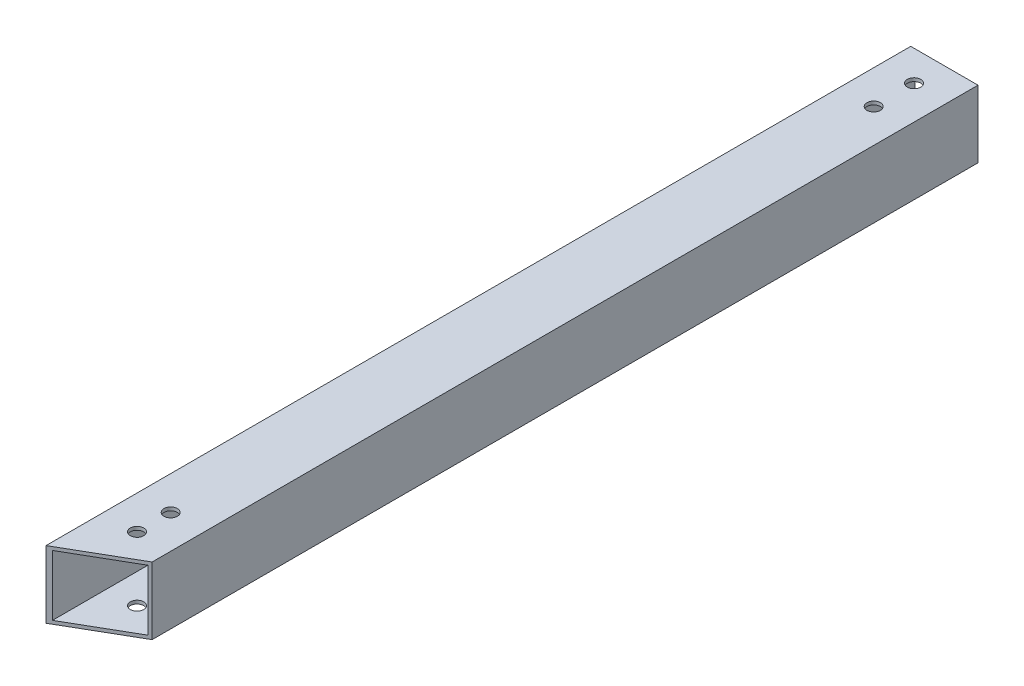
ISO-10303-21;
HEADER;
FILE_DESCRIPTION(('STEP AP214'),'2;1');
FILE_NAME('part.step','',(''),(''),'','','');
FILE_SCHEMA(('AUTOMOTIVE_DESIGN { 1 0 10303 214 1 1 1 1 }'));
ENDSEC;
DATA;
#1=APPLICATION_CONTEXT('core data for automotive mechanical design processes');
#2=APPLICATION_PROTOCOL_DEFINITION('international standard','automotive_design',2000,#1);
#3=PRODUCT_CONTEXT('',#1,'mechanical');
#4=PRODUCT('Part','Part','',(#3));
#5=PRODUCT_RELATED_PRODUCT_CATEGORY('part','',(#4));
#6=PRODUCT_DEFINITION_FORMATION('','',#4);
#7=PRODUCT_DEFINITION_CONTEXT('part definition',#1,'design');
#8=PRODUCT_DEFINITION('design','',#6,#7);
#9=PRODUCT_DEFINITION_SHAPE('','',#8);
#10=(LENGTH_UNIT() NAMED_UNIT(*) SI_UNIT(.MILLI.,.METRE.));
#11=(NAMED_UNIT(*) PLANE_ANGLE_UNIT() SI_UNIT($,.RADIAN.));
#12=(NAMED_UNIT(*) SI_UNIT($,.STERADIAN.) SOLID_ANGLE_UNIT());
#13=UNCERTAINTY_MEASURE_WITH_UNIT(LENGTH_MEASURE(1.E-05),#10,'distance_accuracy_value','');
#14=(GEOMETRIC_REPRESENTATION_CONTEXT(3) GLOBAL_UNCERTAINTY_ASSIGNED_CONTEXT((#13)) GLOBAL_UNIT_ASSIGNED_CONTEXT((#10,
#11,#12)) REPRESENTATION_CONTEXT('',''));
#15=CARTESIAN_POINT('',(0.,0.,0.));
#16=DIRECTION('',(0.,0.,1.));
#17=DIRECTION('',(1.,0.,0.));
#18=AXIS2_PLACEMENT_3D('',#15,#16,#17);
#19=CARTESIAN_POINT('',(-0.212466242561923,20.,111.466876622278));
#20=DIRECTION('',(0.,-1.,0.));
#21=DIRECTION('',(0.,0.,-1.));
#22=AXIS2_PLACEMENT_3D('',#19,#20,#21);
#23=CYLINDRICAL_SURFACE('',#22,2.);
#24=CARTESIAN_POINT('',(-0.212466242561923,1.,111.466876622278));
#25=DIRECTION('',(0.,-1.,0.));
#26=DIRECTION('',(0.,0.,-1.));
#27=AXIS2_PLACEMENT_3D('',#24,#25,#26);
#28=CIRCLE('',#27,2.);
#29=CARTESIAN_POINT('',(-0.212466242561923,1.,109.466876622278));
#30=VERTEX_POINT('',#29);
#31=EDGE_CURVE('E172',#30,#30,#28,.T.);
#32=ORIENTED_EDGE('',*,*,#31,.F.);
#33=EDGE_LOOP('',(#32));
#34=FACE_BOUND('',#33,.T.);
#35=CARTESIAN_POINT('',(-0.212466242561923,0.,111.466876622278));
#36=DIRECTION('',(0.,1.,0.));
#37=DIRECTION('',(0.,0.,1.));
#38=AXIS2_PLACEMENT_3D('',#35,#36,#37);
#39=CIRCLE('',#38,2.);
#40=CARTESIAN_POINT('',(-0.212466242561923,0.,113.466876622278));
#41=VERTEX_POINT('',#40);
#42=EDGE_CURVE('E207',#41,#41,#39,.T.);
#43=ORIENTED_EDGE('',*,*,#42,.F.);
#44=EDGE_LOOP('',(#43));
#45=FACE_BOUND('',#44,.T.);
#46=ADVANCED_FACE('F45',(#34,#45),#23,.F.);
#47=CARTESIAN_POINT('',(-0.212466242561923,20.,101.466876622278));
#48=DIRECTION('',(0.,-1.,0.));
#49=DIRECTION('',(0.,0.,-1.));
#50=AXIS2_PLACEMENT_3D('',#47,#48,#49);
#51=CYLINDRICAL_SURFACE('',#50,1.99999999999992);
#52=CARTESIAN_POINT('',(-0.212466242561923,1.,101.466876622278));
#53=DIRECTION('',(0.,-1.,0.));
#54=DIRECTION('',(0.,0.,-1.));
#55=AXIS2_PLACEMENT_3D('',#52,#53,#54);
#56=CIRCLE('',#55,1.99999999999992);
#57=CARTESIAN_POINT('',(-0.212466242561923,1.,99.4668766222779));
#58=VERTEX_POINT('',#57);
#59=EDGE_CURVE('E168',#58,#58,#56,.T.);
#60=ORIENTED_EDGE('',*,*,#59,.F.);
#61=EDGE_LOOP('',(#60));
#62=FACE_BOUND('',#61,.T.);
#63=CARTESIAN_POINT('',(-0.212466242561923,0.,101.466876622278));
#64=DIRECTION('',(0.,1.,0.));
#65=DIRECTION('',(0.,0.,1.));
#66=AXIS2_PLACEMENT_3D('',#63,#64,#65);
#67=CIRCLE('',#66,1.99999999999992);
#68=CARTESIAN_POINT('',(-0.212466242561923,0.,103.466876622278));
#69=VERTEX_POINT('',#68);
#70=EDGE_CURVE('E199',#69,#69,#67,.T.);
#71=ORIENTED_EDGE('',*,*,#70,.F.);
#72=EDGE_LOOP('',(#71));
#73=FACE_BOUND('',#72,.T.);
#74=ADVANCED_FACE('F284',(#62,#73),#51,.F.);
#75=CARTESIAN_POINT('',(-0.212466242561923,20.,-107.533123377722));
#76=DIRECTION('',(0.,-1.,0.));
#77=DIRECTION('',(0.,0.,-1.));
#78=AXIS2_PLACEMENT_3D('',#75,#76,#77);
#79=CYLINDRICAL_SURFACE('',#78,1.99999999999998);
#80=CARTESIAN_POINT('',(-0.212466242561923,1.,-107.533123377722));
#81=DIRECTION('',(0.,-1.,0.));
#82=DIRECTION('',(0.,0.,-1.));
#83=AXIS2_PLACEMENT_3D('',#80,#81,#82);
#84=CIRCLE('',#83,1.99999999999998);
#85=CARTESIAN_POINT('',(-0.212466242561923,1.,-109.533123377722));
#86=VERTEX_POINT('',#85);
#87=EDGE_CURVE('E164',#86,#86,#84,.T.);
#88=ORIENTED_EDGE('',*,*,#87,.F.);
#89=EDGE_LOOP('',(#88));
#90=FACE_BOUND('',#89,.T.);
#91=CARTESIAN_POINT('',(-0.212466242561923,0.,-107.533123377722));
#92=DIRECTION('',(0.,1.,0.));
#93=DIRECTION('',(0.,0.,1.));
#94=AXIS2_PLACEMENT_3D('',#91,#92,#93);
#95=CIRCLE('',#94,1.99999999999998);
#96=CARTESIAN_POINT('',(-0.212466242561923,0.,-105.533123377722));
#97=VERTEX_POINT('',#96);
#98=EDGE_CURVE('E191',#97,#97,#95,.T.);
#99=ORIENTED_EDGE('',*,*,#98,.F.);
#100=EDGE_LOOP('',(#99));
#101=FACE_BOUND('',#100,.T.);
#102=ADVANCED_FACE('F279',(#90,#101),#79,.F.);
#103=CARTESIAN_POINT('',(-0.212466242561729,20.,-119.533123377722));
#104=DIRECTION('',(0.,-1.,0.));
#105=DIRECTION('',(0.,0.,-1.));
#106=AXIS2_PLACEMENT_3D('',#103,#104,#105);
#107=CYLINDRICAL_SURFACE('',#106,2.);
#108=CARTESIAN_POINT('',(-0.212466242561729,1.,-119.533123377722));
#109=DIRECTION('',(0.,-1.,0.));
#110=DIRECTION('',(0.,0.,-1.));
#111=AXIS2_PLACEMENT_3D('',#108,#109,#110);
#112=CIRCLE('',#111,2.);
#113=CARTESIAN_POINT('',(-0.212466242561729,1.,-121.533123377722));
#114=VERTEX_POINT('',#113);
#115=EDGE_CURVE('E49',#114,#114,#112,.T.);
#116=ORIENTED_EDGE('',*,*,#115,.F.);
#117=EDGE_LOOP('',(#116));
#118=FACE_BOUND('',#117,.T.);
#119=CARTESIAN_POINT('',(-0.212466242561729,0.,-119.533123377722));
#120=DIRECTION('',(0.,1.,0.));
#121=DIRECTION('',(0.,0.,1.));
#122=AXIS2_PLACEMENT_3D('',#119,#120,#121);
#123=CIRCLE('',#122,2.);
#124=CARTESIAN_POINT('',(-0.212466242561729,0.,-117.533123377722));
#125=VERTEX_POINT('',#124);
#126=EDGE_CURVE('E186',#125,#125,#123,.T.);
#127=ORIENTED_EDGE('',*,*,#126,.F.);
#128=EDGE_LOOP('',(#127));
#129=FACE_BOUND('',#128,.T.);
#130=ADVANCED_FACE('F265',(#118,#129),#107,.F.);
#131=CARTESIAN_POINT('',(0.,20.,0.));
#132=DIRECTION('',(0.,-1.,0.));
#133=DIRECTION('',(0.,0.,-1.));
#134=AXIS2_PLACEMENT_3D('',#131,#132,#133);
#135=PLANE('',#134);
#136=DIRECTION('',(0.,0.,1.));
#137=VECTOR('',#136,1.);
#138=CARTESIAN_POINT('',(-10.2124662425619,20.,128.531216924369));
#139=LINE('',#138,#137);
#140=CARTESIAN_POINT('',(-10.2124662425619,20.,-128.533123377722));
#141=VERTEX_POINT('',#140);
#142=CARTESIAN_POINT('',(-10.2124662425619,20.,128.531216924369));
#143=VERTEX_POINT('',#142);
#144=EDGE_CURVE('E219',#141,#143,#139,.T.);
#145=ORIENTED_EDGE('',*,*,#144,.T.);
#146=DIRECTION('',(0.866025403784437,0.,-0.500000000000003));
#147=VECTOR('',#146,1.);
#148=CARTESIAN_POINT('',(9.78753375743806,20.,116.984211540576));
#149=LINE('',#148,#147);
#150=CARTESIAN_POINT('',(9.78753375743806,20.,116.984211540576));
#151=VERTEX_POINT('',#150);
#152=EDGE_CURVE('E223',#143,#151,#149,.T.);
#153=ORIENTED_EDGE('',*,*,#152,.T.);
#154=DIRECTION('',(0.,0.,-1.));
#155=VECTOR('',#154,1.);
#156=CARTESIAN_POINT('',(9.78753375743806,20.,-128.533123377722));
#157=LINE('',#156,#155);
#158=CARTESIAN_POINT('',(9.78753375743806,20.,-128.533123377722));
#159=VERTEX_POINT('',#158);
#160=EDGE_CURVE('E227',#151,#159,#157,.T.);
#161=ORIENTED_EDGE('',*,*,#160,.T.);
#162=DIRECTION('',(-1.,0.,0.));
#163=VECTOR('',#162,1.);
#164=CARTESIAN_POINT('',(-10.2124662425619,20.,-128.533123377722));
#165=LINE('',#164,#163);
#166=EDGE_CURVE('E230',#159,#141,#165,.T.);
#167=ORIENTED_EDGE('',*,*,#166,.T.);
#168=EDGE_LOOP('',(#145,#153,#161,#167));
#169=FACE_BOUND('',#168,.T.);
#170=CARTESIAN_POINT('',(-0.212466242561923,20.,111.466876622278));
#171=DIRECTION('',(0.,1.,0.));
#172=DIRECTION('',(0.,0.,1.));
#173=AXIS2_PLACEMENT_3D('',#170,#171,#172);
#174=CIRCLE('',#173,2.);
#175=CARTESIAN_POINT('',(-0.212466242561923,20.,113.466876622278));
#176=VERTEX_POINT('',#175);
#177=EDGE_CURVE('E211',#176,#176,#174,.T.);
#178=ORIENTED_EDGE('',*,*,#177,.F.);
#179=EDGE_LOOP('',(#178));
#180=FACE_BOUND('',#179,.T.);
#181=CARTESIAN_POINT('',(-0.212466242561923,20.,101.466876622278));
#182=DIRECTION('',(0.,1.,0.));
#183=DIRECTION('',(0.,0.,1.));
#184=AXIS2_PLACEMENT_3D('',#181,#182,#183);
#185=CIRCLE('',#184,1.99999999999992);
#186=CARTESIAN_POINT('',(-0.212466242561923,20.,103.466876622278));
#187=VERTEX_POINT('',#186);
#188=EDGE_CURVE('E203',#187,#187,#185,.T.);
#189=ORIENTED_EDGE('',*,*,#188,.F.);
#190=EDGE_LOOP('',(#189));
#191=FACE_BOUND('',#190,.T.);
#192=CARTESIAN_POINT('',(-0.212466242561923,20.,-107.533123377722));
#193=DIRECTION('',(0.,1.,0.));
#194=DIRECTION('',(0.,0.,1.));
#195=AXIS2_PLACEMENT_3D('',#192,#193,#194);
#196=CIRCLE('',#195,1.99999999999998);
#197=CARTESIAN_POINT('',(-0.212466242561923,20.,-105.533123377722));
#198=VERTEX_POINT('',#197);
#199=EDGE_CURVE('E195',#198,#198,#196,.T.);
#200=ORIENTED_EDGE('',*,*,#199,.F.);
#201=EDGE_LOOP('',(#200));
#202=FACE_BOUND('',#201,.T.);
#203=CARTESIAN_POINT('',(-0.212466242561729,20.,-119.533123377722));
#204=DIRECTION('',(0.,1.,0.));
#205=DIRECTION('',(0.,0.,1.));
#206=AXIS2_PLACEMENT_3D('',#203,#204,#205);
#207=CIRCLE('',#206,2.);
#208=CARTESIAN_POINT('',(-0.212466242561729,20.,-117.533123377722));
#209=VERTEX_POINT('',#208);
#210=EDGE_CURVE('E187',#209,#209,#207,.T.);
#211=ORIENTED_EDGE('',*,*,#210,.F.);
#212=EDGE_LOOP('',(#211));
#213=FACE_BOUND('',#212,.T.);
#214=ADVANCED_FACE('F268',(#169,#180,#191,#202,#213),#135,.F.);
#215=CARTESIAN_POINT('',(0.,0.,0.));
#216=DIRECTION('',(0.,-1.,0.));
#217=DIRECTION('',(0.,0.,-1.));
#218=AXIS2_PLACEMENT_3D('',#215,#216,#217);
#219=PLANE('',#218);
#220=ORIENTED_EDGE('',*,*,#98,.T.);
#221=EDGE_LOOP('',(#220));
#222=FACE_BOUND('',#221,.T.);
#223=ORIENTED_EDGE('',*,*,#42,.T.);
#224=EDGE_LOOP('',(#223));
#225=FACE_BOUND('',#224,.T.);
#226=DIRECTION('',(0.,0.,1.));
#227=VECTOR('',#226,1.);
#228=CARTESIAN_POINT('',(-10.2124662425619,0.,128.531216924369));
#229=LINE('',#228,#227);
#230=CARTESIAN_POINT('',(-10.2124662425619,0.,-128.533123377722));
#231=VERTEX_POINT('',#230);
#232=CARTESIAN_POINT('',(-10.2124662425619,0.,128.531216924369));
#233=VERTEX_POINT('',#232);
#234=EDGE_CURVE('E215',#231,#233,#229,.T.);
#235=ORIENTED_EDGE('',*,*,#234,.F.);
#236=DIRECTION('',(-1.,0.,0.));
#237=VECTOR('',#236,1.);
#238=CARTESIAN_POINT('',(-10.2124662425619,0.,-128.533123377722));
#239=LINE('',#238,#237);
#240=CARTESIAN_POINT('',(9.78753375743806,0.,-128.533123377722));
#241=VERTEX_POINT('',#240);
#242=EDGE_CURVE('E224',#241,#231,#239,.T.);
#243=ORIENTED_EDGE('',*,*,#242,.F.);
#244=DIRECTION('',(0.,0.,-1.));
#245=VECTOR('',#244,1.);
#246=CARTESIAN_POINT('',(9.78753375743806,0.,-128.533123377722));
#247=LINE('',#246,#245);
#248=CARTESIAN_POINT('',(9.78753375743806,0.,116.984211540576));
#249=VERTEX_POINT('',#248);
#250=EDGE_CURVE('E240',#249,#241,#247,.T.);
#251=ORIENTED_EDGE('',*,*,#250,.F.);
#252=DIRECTION('',(0.866025403784437,0.,-0.500000000000003));
#253=VECTOR('',#252,1.);
#254=CARTESIAN_POINT('',(9.78753375743806,0.,116.984211540576));
#255=LINE('',#254,#253);
#256=EDGE_CURVE('E237',#233,#249,#255,.T.);
#257=ORIENTED_EDGE('',*,*,#256,.F.);
#258=EDGE_LOOP('',(#235,#243,#251,#257));
#259=FACE_BOUND('',#258,.T.);
#260=ORIENTED_EDGE('',*,*,#70,.T.);
#261=EDGE_LOOP('',(#260));
#262=FACE_BOUND('',#261,.T.);
#263=ORIENTED_EDGE('',*,*,#126,.T.);
#264=EDGE_LOOP('',(#263));
#265=FACE_BOUND('',#264,.T.);
#266=ADVANCED_FACE('F270',(#222,#225,#259,#262,#265),#219,.T.);
#267=CARTESIAN_POINT('',(-10.2124662425619,20.,128.531216924369));
#268=DIRECTION('',(1.,0.,0.));
#269=DIRECTION('',(0.,0.,-1.));
#270=AXIS2_PLACEMENT_3D('',#267,#268,#269);
#271=PLANE('',#270);
#272=ORIENTED_EDGE('',*,*,#234,.T.);
#273=DIRECTION('',(0.,-1.,0.));
#274=VECTOR('',#273,1.);
#275=CARTESIAN_POINT('',(-10.2124662425619,20.,128.531216924369));
#276=LINE('',#275,#274);
#277=EDGE_CURVE('E11',#143,#233,#276,.T.);
#278=ORIENTED_EDGE('',*,*,#277,.F.);
#279=ORIENTED_EDGE('',*,*,#144,.F.);
#280=DIRECTION('',(0.,-1.,0.));
#281=VECTOR('',#280,1.);
#282=CARTESIAN_POINT('',(-10.2124662425619,20.,-128.533123377722));
#283=LINE('',#282,#281);
#284=EDGE_CURVE('E233',#141,#231,#283,.T.);
#285=ORIENTED_EDGE('',*,*,#284,.T.);
#286=EDGE_LOOP('',(#272,#278,#279,#285));
#287=FACE_BOUND('',#286,.T.);
#288=ADVANCED_FACE('F47',(#287),#271,.F.);
#289=CARTESIAN_POINT('',(9.78753375743806,20.,116.984211540576));
#290=DIRECTION('',(-0.500000000000003,0.,-0.866025403784437));
#291=DIRECTION('',(-0.866025403784437,0.,0.500000000000003));
#292=AXIS2_PLACEMENT_3D('',#289,#290,#291);
#293=PLANE('',#292);
#294=DIRECTION('',(-0.866025403784437,0.,0.500000000000003));
#295=VECTOR('',#294,1.);
#296=CARTESIAN_POINT('',(9.78753375743806,1.,116.984211540576));
#297=LINE('',#296,#295);
#298=CARTESIAN_POINT('',(9.,1.,117.438894367429));
#299=VERTEX_POINT('',#298);
#300=CARTESIAN_POINT('',(-9.,1.,127.831199212842));
#301=VERTEX_POINT('',#300);
#302=EDGE_CURVE('E176',#299,#301,#297,.T.);
#303=ORIENTED_EDGE('',*,*,#302,.T.);
#304=DIRECTION('',(0.,1.,0.));
#305=VECTOR('',#304,1.);
#306=CARTESIAN_POINT('',(-9.,20.,127.831199212842));
#307=LINE('',#306,#305);
#308=CARTESIAN_POINT('',(-9.,19.,127.831199212842));
#309=VERTEX_POINT('',#308);
#310=EDGE_CURVE('E182',#301,#309,#307,.T.);
#311=ORIENTED_EDGE('',*,*,#310,.T.);
#312=DIRECTION('',(0.866025403784437,0.,-0.500000000000003));
#313=VECTOR('',#312,1.);
#314=CARTESIAN_POINT('',(9.78753375743806,19.,116.984211540576));
#315=LINE('',#314,#313);
#316=CARTESIAN_POINT('',(9.,19.,117.438894367429));
#317=VERTEX_POINT('',#316);
#318=EDGE_CURVE('E161',#309,#317,#315,.T.);
#319=ORIENTED_EDGE('',*,*,#318,.T.);
#320=DIRECTION('',(0.,-1.,0.));
#321=VECTOR('',#320,1.);
#322=CARTESIAN_POINT('',(9.,20.,117.438894367429));
#323=LINE('',#322,#321);
#324=EDGE_CURVE('E119',#317,#299,#323,.T.);
#325=ORIENTED_EDGE('',*,*,#324,.T.);
#326=EDGE_LOOP('',(#303,#311,#319,#325));
#327=FACE_BOUND('',#326,.T.);
#328=ORIENTED_EDGE('',*,*,#256,.T.);
#329=DIRECTION('',(0.,-1.,0.));
#330=VECTOR('',#329,1.);
#331=CARTESIAN_POINT('',(9.78753375743806,20.,116.984211540576));
#332=LINE('',#331,#330);
#333=EDGE_CURVE('E55',#151,#249,#332,.T.);
#334=ORIENTED_EDGE('',*,*,#333,.F.);
#335=ORIENTED_EDGE('',*,*,#152,.F.);
#336=ORIENTED_EDGE('',*,*,#277,.T.);
#337=EDGE_LOOP('',(#328,#334,#335,#336));
#338=FACE_BOUND('',#337,.T.);
#339=ADVANCED_FACE('F348',(#327,#338),#293,.F.);
#340=CARTESIAN_POINT('',(9.78753375743806,20.,-128.533123377722));
#341=DIRECTION('',(-1.,0.,0.));
#342=DIRECTION('',(0.,0.,1.));
#343=AXIS2_PLACEMENT_3D('',#340,#341,#342);
#344=PLANE('',#343);
#345=ORIENTED_EDGE('',*,*,#250,.T.);
#346=DIRECTION('',(0.,-1.,0.));
#347=VECTOR('',#346,1.);
#348=CARTESIAN_POINT('',(9.78753375743806,20.,-128.533123377722));
#349=LINE('',#348,#347);
#350=EDGE_CURVE('E248',#159,#241,#349,.T.);
#351=ORIENTED_EDGE('',*,*,#350,.F.);
#352=ORIENTED_EDGE('',*,*,#160,.F.);
#353=ORIENTED_EDGE('',*,*,#333,.T.);
#354=EDGE_LOOP('',(#345,#351,#352,#353));
#355=FACE_BOUND('',#354,.T.);
#356=ADVANCED_FACE('F303',(#355),#344,.F.);
#357=CARTESIAN_POINT('',(-10.2124662425619,20.,-128.533123377722));
#358=DIRECTION('',(0.,0.,1.));
#359=DIRECTION('',(1.,0.,0.));
#360=AXIS2_PLACEMENT_3D('',#357,#358,#359);
#361=PLANE('',#360);
#362=DIRECTION('',(1.,0.,0.));
#363=VECTOR('',#362,1.);
#364=CARTESIAN_POINT('',(9.,19.,-128.533123377722));
#365=LINE('',#364,#363);
#366=CARTESIAN_POINT('',(-9.,19.,-128.533123377722));
#367=VERTEX_POINT('',#366);
#368=CARTESIAN_POINT('',(9.,19.,-128.533123377722));
#369=VERTEX_POINT('',#368);
#370=EDGE_CURVE('E126',#367,#369,#365,.T.);
#371=ORIENTED_EDGE('',*,*,#370,.F.);
#372=DIRECTION('',(0.,1.,0.));
#373=VECTOR('',#372,1.);
#374=CARTESIAN_POINT('',(-9.,19.,-128.533123377722));
#375=LINE('',#374,#373);
#376=CARTESIAN_POINT('',(-9.,1.,-128.533123377722));
#377=VERTEX_POINT('',#376);
#378=EDGE_CURVE('E71',#377,#367,#375,.T.);
#379=ORIENTED_EDGE('',*,*,#378,.F.);
#380=DIRECTION('',(-1.,0.,0.));
#381=VECTOR('',#380,1.);
#382=CARTESIAN_POINT('',(9.,1.,-128.533123377722));
#383=LINE('',#382,#381);
#384=CARTESIAN_POINT('',(9.,1.,-128.533123377722));
#385=VERTEX_POINT('',#384);
#386=EDGE_CURVE('E134',#385,#377,#383,.T.);
#387=ORIENTED_EDGE('',*,*,#386,.F.);
#388=DIRECTION('',(0.,-1.,0.));
#389=VECTOR('',#388,1.);
#390=CARTESIAN_POINT('',(9.,19.,-128.533123377722));
#391=LINE('',#390,#389);
#392=EDGE_CURVE('E116',#369,#385,#391,.T.);
#393=ORIENTED_EDGE('',*,*,#392,.F.);
#394=EDGE_LOOP('',(#371,#379,#387,#393));
#395=FACE_BOUND('',#394,.T.);
#396=ORIENTED_EDGE('',*,*,#242,.T.);
#397=ORIENTED_EDGE('',*,*,#284,.F.);
#398=ORIENTED_EDGE('',*,*,#166,.F.);
#399=ORIENTED_EDGE('',*,*,#350,.T.);
#400=EDGE_LOOP('',(#396,#397,#398,#399));
#401=FACE_BOUND('',#400,.T.);
#402=ADVANCED_FACE('F131',(#395,#401),#361,.F.);
#403=CARTESIAN_POINT('',(-0.212466242561923,19.,111.466876622278));
#404=DIRECTION('',(0.,1.,0.));
#405=DIRECTION('',(-1.,0.,0.));
#406=AXIS2_PLACEMENT_3D('',#403,#404,#405);
#407=CIRCLE('',#406,2.);
#408=CARTESIAN_POINT('',(-2.21246624256192,19.,111.466876622278));
#409=VERTEX_POINT('',#408);
#410=EDGE_CURVE('E157',#409,#409,#407,.T.);
#411=ORIENTED_EDGE('',*,*,#410,.F.);
#412=EDGE_LOOP('',(#411));
#413=FACE_BOUND('',#412,.T.);
#414=ORIENTED_EDGE('',*,*,#177,.T.);
#415=EDGE_LOOP('',(#414));
#416=FACE_BOUND('',#415,.T.);
#417=ADVANCED_FACE('F286',(#413,#416),#23,.F.);
#418=CARTESIAN_POINT('',(-0.212466242561923,19.,101.466876622278));
#419=DIRECTION('',(0.,1.,0.));
#420=DIRECTION('',(-1.,0.,0.));
#421=AXIS2_PLACEMENT_3D('',#418,#419,#420);
#422=CIRCLE('',#421,1.99999999999992);
#423=CARTESIAN_POINT('',(-2.21246624256184,19.,101.466876622278));
#424=VERTEX_POINT('',#423);
#425=EDGE_CURVE('E153',#424,#424,#422,.T.);
#426=ORIENTED_EDGE('',*,*,#425,.F.);
#427=EDGE_LOOP('',(#426));
#428=FACE_BOUND('',#427,.T.);
#429=ORIENTED_EDGE('',*,*,#188,.T.);
#430=EDGE_LOOP('',(#429));
#431=FACE_BOUND('',#430,.T.);
#432=ADVANCED_FACE('F293',(#428,#431),#51,.F.);
#433=CARTESIAN_POINT('',(-0.212466242561923,19.,-107.533123377722));
#434=DIRECTION('',(0.,1.,0.));
#435=DIRECTION('',(-1.,0.,0.));
#436=AXIS2_PLACEMENT_3D('',#433,#434,#435);
#437=CIRCLE('',#436,1.99999999999998);
#438=CARTESIAN_POINT('',(-2.21246624256191,19.,-107.533123377722));
#439=VERTEX_POINT('',#438);
#440=EDGE_CURVE('E149',#439,#439,#437,.T.);
#441=ORIENTED_EDGE('',*,*,#440,.F.);
#442=EDGE_LOOP('',(#441));
#443=FACE_BOUND('',#442,.T.);
#444=ORIENTED_EDGE('',*,*,#199,.T.);
#445=EDGE_LOOP('',(#444));
#446=FACE_BOUND('',#445,.T.);
#447=ADVANCED_FACE('F263',(#443,#446),#79,.F.);
#448=CARTESIAN_POINT('',(-0.212466242561729,19.,-119.533123377722));
#449=DIRECTION('',(0.,1.,0.));
#450=DIRECTION('',(-1.,0.,0.));
#451=AXIS2_PLACEMENT_3D('',#448,#449,#450);
#452=CIRCLE('',#451,2.);
#453=CARTESIAN_POINT('',(-2.21246624256173,19.,-119.533123377722));
#454=VERTEX_POINT('',#453);
#455=EDGE_CURVE('E144',#454,#454,#452,.T.);
#456=ORIENTED_EDGE('',*,*,#455,.F.);
#457=EDGE_LOOP('',(#456));
#458=FACE_BOUND('',#457,.T.);
#459=ORIENTED_EDGE('',*,*,#210,.T.);
#460=EDGE_LOOP('',(#459));
#461=FACE_BOUND('',#460,.T.);
#462=ADVANCED_FACE('F259',(#458,#461),#107,.F.);
#463=CARTESIAN_POINT('',(-9.,19.,128.531216924369));
#464=DIRECTION('',(-1.,0.,0.));
#465=DIRECTION('',(0.,0.,1.));
#466=AXIS2_PLACEMENT_3D('',#463,#464,#465);
#467=PLANE('',#466);
#468=DIRECTION('',(0.,0.,-1.));
#469=VECTOR('',#468,1.);
#470=CARTESIAN_POINT('',(-9.,1.,128.531216924369));
#471=LINE('',#470,#469);
#472=EDGE_CURVE('E141',#301,#377,#471,.T.);
#473=ORIENTED_EDGE('',*,*,#472,.T.);
#474=ORIENTED_EDGE('',*,*,#378,.T.);
#475=DIRECTION('',(0.,0.,-1.));
#476=VECTOR('',#475,1.);
#477=CARTESIAN_POINT('',(-9.,19.,128.531216924369));
#478=LINE('',#477,#476);
#479=EDGE_CURVE('E123',#309,#367,#478,.T.);
#480=ORIENTED_EDGE('',*,*,#479,.F.);
#481=ORIENTED_EDGE('',*,*,#310,.F.);
#482=EDGE_LOOP('',(#473,#474,#480,#481));
#483=FACE_BOUND('',#482,.T.);
#484=ADVANCED_FACE('F262',(#483),#467,.F.);
#485=CARTESIAN_POINT('',(9.,19.,128.531216924369));
#486=DIRECTION('',(1.,0.,0.));
#487=DIRECTION('',(0.,0.,-1.));
#488=AXIS2_PLACEMENT_3D('',#485,#486,#487);
#489=PLANE('',#488);
#490=DIRECTION('',(0.,0.,-1.));
#491=VECTOR('',#490,1.);
#492=CARTESIAN_POINT('',(9.,19.,128.531216924369));
#493=LINE('',#492,#491);
#494=EDGE_CURVE('E63',#317,#369,#493,.T.);
#495=ORIENTED_EDGE('',*,*,#494,.T.);
#496=ORIENTED_EDGE('',*,*,#392,.T.);
#497=DIRECTION('',(0.,0.,-1.));
#498=VECTOR('',#497,1.);
#499=CARTESIAN_POINT('',(9.,1.,128.531216924369));
#500=LINE('',#499,#498);
#501=EDGE_CURVE('E122',#299,#385,#500,.T.);
#502=ORIENTED_EDGE('',*,*,#501,.F.);
#503=ORIENTED_EDGE('',*,*,#324,.F.);
#504=EDGE_LOOP('',(#495,#496,#502,#503));
#505=FACE_BOUND('',#504,.T.);
#506=ADVANCED_FACE('F113',(#505),#489,.F.);
#507=CARTESIAN_POINT('',(9.,1.,128.531216924369));
#508=DIRECTION('',(0.,-1.,0.));
#509=DIRECTION('',(0.,0.,-1.));
#510=AXIS2_PLACEMENT_3D('',#507,#508,#509);
#511=PLANE('',#510);
#512=ORIENTED_EDGE('',*,*,#31,.T.);
#513=EDGE_LOOP('',(#512));
#514=FACE_BOUND('',#513,.T.);
#515=ORIENTED_EDGE('',*,*,#59,.T.);
#516=EDGE_LOOP('',(#515));
#517=FACE_BOUND('',#516,.T.);
#518=ORIENTED_EDGE('',*,*,#87,.T.);
#519=EDGE_LOOP('',(#518));
#520=FACE_BOUND('',#519,.T.);
#521=ORIENTED_EDGE('',*,*,#115,.T.);
#522=EDGE_LOOP('',(#521));
#523=FACE_BOUND('',#522,.T.);
#524=ORIENTED_EDGE('',*,*,#501,.T.);
#525=ORIENTED_EDGE('',*,*,#386,.T.);
#526=ORIENTED_EDGE('',*,*,#472,.F.);
#527=ORIENTED_EDGE('',*,*,#302,.F.);
#528=EDGE_LOOP('',(#524,#525,#526,#527));
#529=FACE_BOUND('',#528,.T.);
#530=ADVANCED_FACE('F357',(#514,#517,#520,#523,#529),#511,.F.);
#531=CARTESIAN_POINT('',(9.,19.,128.531216924369));
#532=DIRECTION('',(0.,1.,0.));
#533=DIRECTION('',(-1.,0.,0.));
#534=AXIS2_PLACEMENT_3D('',#531,#532,#533);
#535=PLANE('',#534);
#536=ORIENTED_EDGE('',*,*,#410,.T.);
#537=EDGE_LOOP('',(#536));
#538=FACE_BOUND('',#537,.T.);
#539=ORIENTED_EDGE('',*,*,#425,.T.);
#540=EDGE_LOOP('',(#539));
#541=FACE_BOUND('',#540,.T.);
#542=ORIENTED_EDGE('',*,*,#440,.T.);
#543=EDGE_LOOP('',(#542));
#544=FACE_BOUND('',#543,.T.);
#545=ORIENTED_EDGE('',*,*,#455,.T.);
#546=EDGE_LOOP('',(#545));
#547=FACE_BOUND('',#546,.T.);
#548=ORIENTED_EDGE('',*,*,#479,.T.);
#549=ORIENTED_EDGE('',*,*,#370,.T.);
#550=ORIENTED_EDGE('',*,*,#494,.F.);
#551=ORIENTED_EDGE('',*,*,#318,.F.);
#552=EDGE_LOOP('',(#548,#549,#550,#551));
#553=FACE_BOUND('',#552,.T.);
#554=ADVANCED_FACE('F127',(#538,#541,#544,#547,#553),#535,.F.);
#555=CLOSED_SHELL('',(#46,#74,#102,#130,#214,#266,#288,#339,#356,#402,#417,#432,#447,#462,#484,
#506,#530,#554));
#556=MANIFOLD_SOLID_BREP('B2',#555);
#557=ADVANCED_BREP_SHAPE_REPRESENTATION('',(#18,#556),#14);
#558=SHAPE_DEFINITION_REPRESENTATION(#9,#557);
ENDSEC;
END-ISO-10303-21;
